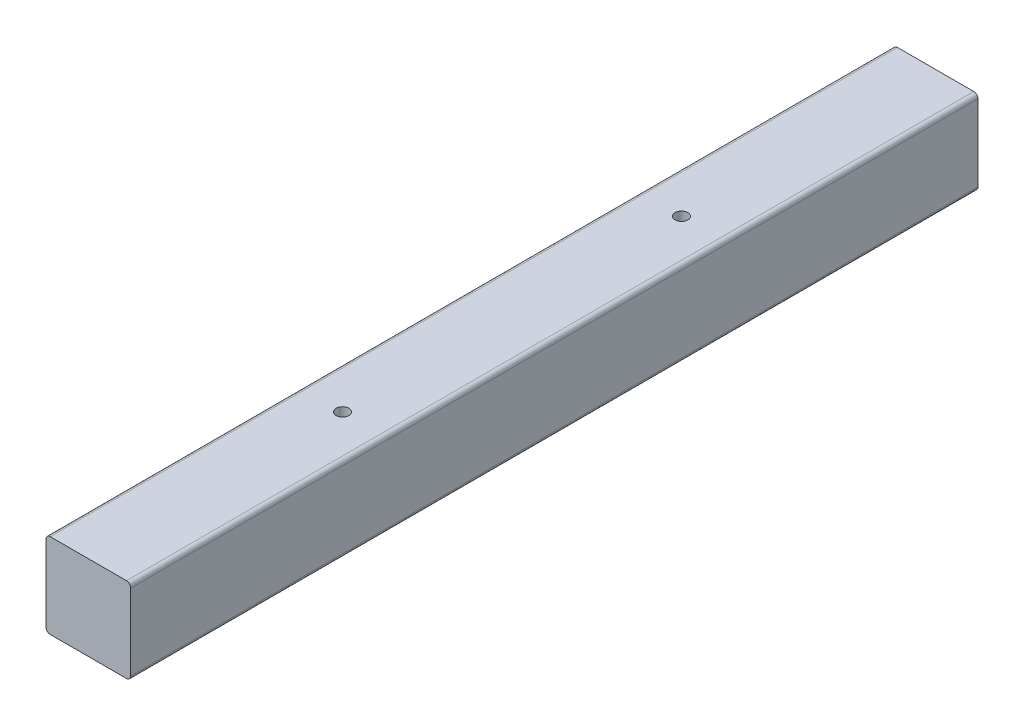
ISO-10303-21;
HEADER;
FILE_DESCRIPTION(('STEP AP214'),'2;1');
FILE_NAME('part.step','',(''),(''),'','','');
FILE_SCHEMA(('AUTOMOTIVE_DESIGN { 1 0 10303 214 1 1 1 1 }'));
ENDSEC;
DATA;
#1=APPLICATION_CONTEXT('core data for automotive mechanical design processes');
#2=APPLICATION_PROTOCOL_DEFINITION('international standard','automotive_design',2000,#1);
#3=PRODUCT_CONTEXT('',#1,'mechanical');
#4=PRODUCT('Part','Part','',(#3));
#5=PRODUCT_RELATED_PRODUCT_CATEGORY('part','',(#4));
#6=PRODUCT_DEFINITION_FORMATION('','',#4);
#7=PRODUCT_DEFINITION_CONTEXT('part definition',#1,'design');
#8=PRODUCT_DEFINITION('design','',#6,#7);
#9=PRODUCT_DEFINITION_SHAPE('','',#8);
#10=(LENGTH_UNIT() NAMED_UNIT(*) SI_UNIT(.MILLI.,.METRE.));
#11=(NAMED_UNIT(*) PLANE_ANGLE_UNIT() SI_UNIT($,.RADIAN.));
#12=(NAMED_UNIT(*) SI_UNIT($,.STERADIAN.) SOLID_ANGLE_UNIT());
#13=UNCERTAINTY_MEASURE_WITH_UNIT(LENGTH_MEASURE(1.E-05),#10,'distance_accuracy_value','');
#14=(GEOMETRIC_REPRESENTATION_CONTEXT(3) GLOBAL_UNCERTAINTY_ASSIGNED_CONTEXT((#13)) GLOBAL_UNIT_ASSIGNED_CONTEXT((#10,
#11,#12)) REPRESENTATION_CONTEXT('',''));
#15=CARTESIAN_POINT('',(0.,0.,0.));
#16=DIRECTION('',(0.,0.,1.));
#17=DIRECTION('',(1.,0.,0.));
#18=AXIS2_PLACEMENT_3D('',#15,#16,#17);
#19=CARTESIAN_POINT('',(-10.,10.,100.));
#20=DIRECTION('',(1.,0.,0.));
#21=DIRECTION('',(0.,1.,0.));
#22=AXIS2_PLACEMENT_3D('',#19,#20,#21);
#23=PLANE('',#22);
#24=DIRECTION('',(0.,-1.,0.));
#25=VECTOR('',#24,1.);
#26=CARTESIAN_POINT('',(-10.,10.,-100.));
#27=LINE('',#26,#25);
#28=CARTESIAN_POINT('',(-10.,9.,-100.));
#29=VERTEX_POINT('',#28);
#30=CARTESIAN_POINT('',(-10.,-9.,-100.));
#31=VERTEX_POINT('',#30);
#32=EDGE_CURVE('E124',#29,#31,#27,.T.);
#33=ORIENTED_EDGE('',*,*,#32,.T.);
#34=DIRECTION('',(0.,0.,-1.));
#35=VECTOR('',#34,1.);
#36=CARTESIAN_POINT('',(-10.,-9.,100.));
#37=LINE('',#36,#35);
#38=CARTESIAN_POINT('',(-10.,-9.,100.));
#39=VERTEX_POINT('',#38);
#40=EDGE_CURVE('E102',#31,#39,#37,.F.);
#41=ORIENTED_EDGE('',*,*,#40,.T.);
#42=DIRECTION('',(0.,-1.,0.));
#43=VECTOR('',#42,1.);
#44=CARTESIAN_POINT('',(-10.,10.,100.));
#45=LINE('',#44,#43);
#46=CARTESIAN_POINT('',(-10.,9.,100.));
#47=VERTEX_POINT('',#46);
#48=EDGE_CURVE('E134',#47,#39,#45,.T.);
#49=ORIENTED_EDGE('',*,*,#48,.F.);
#50=DIRECTION('',(0.,0.,-1.));
#51=VECTOR('',#50,1.);
#52=CARTESIAN_POINT('',(-10.,9.,100.));
#53=LINE('',#52,#51);
#54=EDGE_CURVE('E107',#47,#29,#53,.T.);
#55=ORIENTED_EDGE('',*,*,#54,.T.);
#56=EDGE_LOOP('',(#33,#41,#49,#55));
#57=FACE_BOUND('',#56,.T.);
#58=ADVANCED_FACE('F31',(#57),#23,.F.);
#59=CARTESIAN_POINT('',(-10.,-10.,100.));
#60=DIRECTION('',(0.,1.,0.));
#61=DIRECTION('',(0.,0.,1.));
#62=AXIS2_PLACEMENT_3D('',#59,#60,#61);
#63=PLANE('',#62);
#64=CARTESIAN_POINT('',(0.,-10.,40.));
#65=DIRECTION('',(0.,1.,0.));
#66=DIRECTION('',(0.,0.,1.));
#67=AXIS2_PLACEMENT_3D('',#64,#65,#66);
#68=CIRCLE('',#67,1.5);
#69=CARTESIAN_POINT('',(-1.5,-10.,40.));
#70=VERTEX_POINT('',#69);
#71=EDGE_CURVE('E179',#70,#70,#68,.F.);
#72=ORIENTED_EDGE('',*,*,#71,.F.);
#73=EDGE_LOOP('',(#72));
#74=FACE_BOUND('',#73,.T.);
#75=CARTESIAN_POINT('',(0.,-10.,-40.));
#76=DIRECTION('',(0.,1.,0.));
#77=DIRECTION('',(0.,0.,1.));
#78=AXIS2_PLACEMENT_3D('',#75,#76,#77);
#79=CIRCLE('',#78,1.5);
#80=CARTESIAN_POINT('',(-1.5,-10.,-40.));
#81=VERTEX_POINT('',#80);
#82=EDGE_CURVE('E129',#81,#81,#79,.F.);
#83=ORIENTED_EDGE('',*,*,#82,.F.);
#84=EDGE_LOOP('',(#83));
#85=FACE_BOUND('',#84,.T.);
#86=DIRECTION('',(1.,0.,0.));
#87=VECTOR('',#86,1.);
#88=CARTESIAN_POINT('',(-10.,-10.,100.));
#89=LINE('',#88,#87);
#90=CARTESIAN_POINT('',(-9.,-10.,100.));
#91=VERTEX_POINT('',#90);
#92=CARTESIAN_POINT('',(9.,-10.,100.));
#93=VERTEX_POINT('',#92);
#94=EDGE_CURVE('E117',#91,#93,#89,.T.);
#95=ORIENTED_EDGE('',*,*,#94,.F.);
#96=DIRECTION('',(0.,0.,-1.));
#97=VECTOR('',#96,1.);
#98=CARTESIAN_POINT('',(-9.,-10.,100.));
#99=LINE('',#98,#97);
#100=CARTESIAN_POINT('',(-9.,-10.,-100.));
#101=VERTEX_POINT('',#100);
#102=EDGE_CURVE('E101',#91,#101,#99,.T.);
#103=ORIENTED_EDGE('',*,*,#102,.T.);
#104=DIRECTION('',(1.,0.,0.));
#105=VECTOR('',#104,1.);
#106=CARTESIAN_POINT('',(-10.,-10.,-100.));
#107=LINE('',#106,#105);
#108=CARTESIAN_POINT('',(9.,-10.,-100.));
#109=VERTEX_POINT('',#108);
#110=EDGE_CURVE('E114',#101,#109,#107,.T.);
#111=ORIENTED_EDGE('',*,*,#110,.T.);
#112=DIRECTION('',(0.,0.,-1.));
#113=VECTOR('',#112,1.);
#114=CARTESIAN_POINT('',(9.,-10.,100.));
#115=LINE('',#114,#113);
#116=EDGE_CURVE('E119',#109,#93,#115,.F.);
#117=ORIENTED_EDGE('',*,*,#116,.T.);
#118=EDGE_LOOP('',(#95,#103,#111,#117));
#119=FACE_BOUND('',#118,.T.);
#120=ADVANCED_FACE('F113',(#74,#85,#119),#63,.F.);
#121=CARTESIAN_POINT('',(10.,10.,100.));
#122=DIRECTION('',(-1.,0.,0.));
#123=DIRECTION('',(0.,-1.,0.));
#124=AXIS2_PLACEMENT_3D('',#121,#122,#123);
#125=PLANE('',#124);
#126=DIRECTION('',(0.,1.,0.));
#127=VECTOR('',#126,1.);
#128=CARTESIAN_POINT('',(10.,10.,100.));
#129=LINE('',#128,#127);
#130=CARTESIAN_POINT('',(10.,-9.,100.));
#131=VERTEX_POINT('',#130);
#132=CARTESIAN_POINT('',(10.,9.,100.));
#133=VERTEX_POINT('',#132);
#134=EDGE_CURVE('E160',#131,#133,#129,.T.);
#135=ORIENTED_EDGE('',*,*,#134,.F.);
#136=DIRECTION('',(0.,0.,-1.));
#137=VECTOR('',#136,1.);
#138=CARTESIAN_POINT('',(10.,-9.,100.));
#139=LINE('',#138,#137);
#140=CARTESIAN_POINT('',(10.,-9.,-100.));
#141=VERTEX_POINT('',#140);
#142=EDGE_CURVE('E153',#131,#141,#139,.T.);
#143=ORIENTED_EDGE('',*,*,#142,.T.);
#144=DIRECTION('',(0.,1.,0.));
#145=VECTOR('',#144,1.);
#146=CARTESIAN_POINT('',(10.,10.,-100.));
#147=LINE('',#146,#145);
#148=CARTESIAN_POINT('',(10.,9.,-100.));
#149=VERTEX_POINT('',#148);
#150=EDGE_CURVE('E123',#141,#149,#147,.T.);
#151=ORIENTED_EDGE('',*,*,#150,.T.);
#152=DIRECTION('',(0.,0.,-1.));
#153=VECTOR('',#152,1.);
#154=CARTESIAN_POINT('',(10.,9.,100.));
#155=LINE('',#154,#153);
#156=EDGE_CURVE('E151',#149,#133,#155,.F.);
#157=ORIENTED_EDGE('',*,*,#156,.T.);
#158=EDGE_LOOP('',(#135,#143,#151,#157));
#159=FACE_BOUND('',#158,.T.);
#160=ADVANCED_FACE('F158',(#159),#125,.F.);
#161=CARTESIAN_POINT('',(-10.,10.,100.));
#162=DIRECTION('',(0.,-1.,0.));
#163=DIRECTION('',(1.,0.,0.));
#164=AXIS2_PLACEMENT_3D('',#161,#162,#163);
#165=PLANE('',#164);
#166=CARTESIAN_POINT('',(0.,10.,40.));
#167=DIRECTION('',(0.,1.,0.));
#168=DIRECTION('',(-1.,0.,0.));
#169=AXIS2_PLACEMENT_3D('',#166,#167,#168);
#170=CIRCLE('',#169,1.5);
#171=CARTESIAN_POINT('',(-1.5,10.,40.));
#172=VERTEX_POINT('',#171);
#173=EDGE_CURVE('E182',#172,#172,#170,.T.);
#174=ORIENTED_EDGE('',*,*,#173,.F.);
#175=EDGE_LOOP('',(#174));
#176=FACE_BOUND('',#175,.T.);
#177=CARTESIAN_POINT('',(0.,10.,-40.));
#178=DIRECTION('',(0.,1.,0.));
#179=DIRECTION('',(-1.,0.,0.));
#180=AXIS2_PLACEMENT_3D('',#177,#178,#179);
#181=CIRCLE('',#180,1.5);
#182=CARTESIAN_POINT('',(-1.5,10.,-40.));
#183=VERTEX_POINT('',#182);
#184=EDGE_CURVE('E176',#183,#183,#181,.T.);
#185=ORIENTED_EDGE('',*,*,#184,.F.);
#186=EDGE_LOOP('',(#185));
#187=FACE_BOUND('',#186,.T.);
#188=DIRECTION('',(-1.,0.,0.));
#189=VECTOR('',#188,1.);
#190=CARTESIAN_POINT('',(-10.,10.,100.));
#191=LINE('',#190,#189);
#192=CARTESIAN_POINT('',(9.,10.,100.));
#193=VERTEX_POINT('',#192);
#194=CARTESIAN_POINT('',(-9.,10.,100.));
#195=VERTEX_POINT('',#194);
#196=EDGE_CURVE('E135',#193,#195,#191,.T.);
#197=ORIENTED_EDGE('',*,*,#196,.F.);
#198=DIRECTION('',(0.,0.,-1.));
#199=VECTOR('',#198,1.);
#200=CARTESIAN_POINT('',(9.,10.,100.));
#201=LINE('',#200,#199);
#202=CARTESIAN_POINT('',(9.,10.,-100.));
#203=VERTEX_POINT('',#202);
#204=EDGE_CURVE('E11',#193,#203,#201,.T.);
#205=ORIENTED_EDGE('',*,*,#204,.T.);
#206=DIRECTION('',(-1.,0.,0.));
#207=VECTOR('',#206,1.);
#208=CARTESIAN_POINT('',(-10.,10.,-100.));
#209=LINE('',#208,#207);
#210=CARTESIAN_POINT('',(-9.,10.,-100.));
#211=VERTEX_POINT('',#210);
#212=EDGE_CURVE('E127',#203,#211,#209,.T.);
#213=ORIENTED_EDGE('',*,*,#212,.T.);
#214=DIRECTION('',(0.,0.,-1.));
#215=VECTOR('',#214,1.);
#216=CARTESIAN_POINT('',(-9.,10.,100.));
#217=LINE('',#216,#215);
#218=EDGE_CURVE('E39',#211,#195,#217,.F.);
#219=ORIENTED_EDGE('',*,*,#218,.T.);
#220=EDGE_LOOP('',(#197,#205,#213,#219));
#221=FACE_BOUND('',#220,.T.);
#222=ADVANCED_FACE('F167',(#176,#187,#221),#165,.F.);
#223=CARTESIAN_POINT('',(-10.,-10.,100.));
#224=DIRECTION('',(0.,0.,1.));
#225=DIRECTION('',(1.,0.,0.));
#226=AXIS2_PLACEMENT_3D('',#223,#224,#225);
#227=PLANE('',#226);
#228=ORIENTED_EDGE('',*,*,#48,.T.);
#229=CARTESIAN_POINT('',(-9.,-9.,100.));
#230=DIRECTION('',(0.,0.,1.));
#231=DIRECTION('',(1.,0.,0.));
#232=AXIS2_PLACEMENT_3D('',#229,#230,#231);
#233=CIRCLE('',#232,1.);
#234=EDGE_CURVE('E149',#39,#91,#233,.T.);
#235=ORIENTED_EDGE('',*,*,#234,.T.);
#236=ORIENTED_EDGE('',*,*,#94,.T.);
#237=CARTESIAN_POINT('',(9.,-9.,100.));
#238=DIRECTION('',(0.,0.,1.));
#239=DIRECTION('',(1.,0.,0.));
#240=AXIS2_PLACEMENT_3D('',#237,#238,#239);
#241=CIRCLE('',#240,1.);
#242=EDGE_CURVE('E147',#93,#131,#241,.T.);
#243=ORIENTED_EDGE('',*,*,#242,.T.);
#244=ORIENTED_EDGE('',*,*,#134,.T.);
#245=CARTESIAN_POINT('',(9.,9.,100.));
#246=DIRECTION('',(0.,0.,1.));
#247=DIRECTION('',(1.,0.,0.));
#248=AXIS2_PLACEMENT_3D('',#245,#246,#247);
#249=CIRCLE('',#248,1.);
#250=EDGE_CURVE('E52',#133,#193,#249,.T.);
#251=ORIENTED_EDGE('',*,*,#250,.T.);
#252=ORIENTED_EDGE('',*,*,#196,.T.);
#253=CARTESIAN_POINT('',(-9.,9.,100.));
#254=DIRECTION('',(0.,0.,1.));
#255=DIRECTION('',(1.,0.,0.));
#256=AXIS2_PLACEMENT_3D('',#253,#254,#255);
#257=CIRCLE('',#256,1.);
#258=EDGE_CURVE('E144',#195,#47,#257,.T.);
#259=ORIENTED_EDGE('',*,*,#258,.T.);
#260=EDGE_LOOP('',(#228,#235,#236,#243,#244,#251,#252,#259));
#261=FACE_BOUND('',#260,.T.);
#262=ADVANCED_FACE('F191',(#261),#227,.T.);
#263=CARTESIAN_POINT('',(-10.,-10.,-100.));
#264=DIRECTION('',(0.,0.,1.));
#265=DIRECTION('',(1.,0.,0.));
#266=AXIS2_PLACEMENT_3D('',#263,#264,#265);
#267=PLANE('',#266);
#268=ORIENTED_EDGE('',*,*,#110,.F.);
#269=CARTESIAN_POINT('',(-9.,-9.,-100.));
#270=DIRECTION('',(0.,0.,1.));
#271=DIRECTION('',(1.,0.,0.));
#272=AXIS2_PLACEMENT_3D('',#269,#270,#271);
#273=CIRCLE('',#272,1.);
#274=EDGE_CURVE('E97',#101,#31,#273,.F.);
#275=ORIENTED_EDGE('',*,*,#274,.T.);
#276=ORIENTED_EDGE('',*,*,#32,.F.);
#277=CARTESIAN_POINT('',(-9.,9.,-100.));
#278=DIRECTION('',(0.,0.,1.));
#279=DIRECTION('',(1.,0.,0.));
#280=AXIS2_PLACEMENT_3D('',#277,#278,#279);
#281=CIRCLE('',#280,1.);
#282=EDGE_CURVE('E118',#29,#211,#281,.F.);
#283=ORIENTED_EDGE('',*,*,#282,.T.);
#284=ORIENTED_EDGE('',*,*,#212,.F.);
#285=CARTESIAN_POINT('',(9.,9.,-100.));
#286=DIRECTION('',(0.,0.,1.));
#287=DIRECTION('',(1.,0.,0.));
#288=AXIS2_PLACEMENT_3D('',#285,#286,#287);
#289=CIRCLE('',#288,1.);
#290=EDGE_CURVE('E138',#203,#149,#289,.F.);
#291=ORIENTED_EDGE('',*,*,#290,.T.);
#292=ORIENTED_EDGE('',*,*,#150,.F.);
#293=CARTESIAN_POINT('',(9.,-9.,-100.));
#294=DIRECTION('',(0.,0.,1.));
#295=DIRECTION('',(1.,0.,0.));
#296=AXIS2_PLACEMENT_3D('',#293,#294,#295);
#297=CIRCLE('',#296,1.);
#298=EDGE_CURVE('E108',#141,#109,#297,.F.);
#299=ORIENTED_EDGE('',*,*,#298,.T.);
#300=EDGE_LOOP('',(#268,#275,#276,#283,#284,#291,#292,#299));
#301=FACE_BOUND('',#300,.T.);
#302=ADVANCED_FACE('F121',(#301),#267,.F.);
#303=CARTESIAN_POINT('',(-9.,-9.,100.));
#304=DIRECTION('',(0.,0.,-1.));
#305=DIRECTION('',(-1.,0.,0.));
#306=AXIS2_PLACEMENT_3D('',#303,#304,#305);
#307=CYLINDRICAL_SURFACE('',#306,1.);
#308=ORIENTED_EDGE('',*,*,#234,.F.);
#309=ORIENTED_EDGE('',*,*,#40,.F.);
#310=ORIENTED_EDGE('',*,*,#274,.F.);
#311=ORIENTED_EDGE('',*,*,#102,.F.);
#312=EDGE_LOOP('',(#308,#309,#310,#311));
#313=FACE_BOUND('',#312,.T.);
#314=ADVANCED_FACE('F100',(#313),#307,.T.);
#315=CARTESIAN_POINT('',(9.,-9.,100.));
#316=DIRECTION('',(0.,0.,-1.));
#317=DIRECTION('',(-1.,0.,0.));
#318=AXIS2_PLACEMENT_3D('',#315,#316,#317);
#319=CYLINDRICAL_SURFACE('',#318,1.);
#320=ORIENTED_EDGE('',*,*,#242,.F.);
#321=ORIENTED_EDGE('',*,*,#116,.F.);
#322=ORIENTED_EDGE('',*,*,#298,.F.);
#323=ORIENTED_EDGE('',*,*,#142,.F.);
#324=EDGE_LOOP('',(#320,#321,#322,#323));
#325=FACE_BOUND('',#324,.T.);
#326=ADVANCED_FACE('F216',(#325),#319,.T.);
#327=CARTESIAN_POINT('',(9.,9.,100.));
#328=DIRECTION('',(0.,0.,-1.));
#329=DIRECTION('',(-1.,0.,0.));
#330=AXIS2_PLACEMENT_3D('',#327,#328,#329);
#331=CYLINDRICAL_SURFACE('',#330,1.);
#332=ORIENTED_EDGE('',*,*,#250,.F.);
#333=ORIENTED_EDGE('',*,*,#156,.F.);
#334=ORIENTED_EDGE('',*,*,#290,.F.);
#335=ORIENTED_EDGE('',*,*,#204,.F.);
#336=EDGE_LOOP('',(#332,#333,#334,#335));
#337=FACE_BOUND('',#336,.T.);
#338=ADVANCED_FACE('F166',(#337),#331,.T.);
#339=CARTESIAN_POINT('',(-9.,9.,100.));
#340=DIRECTION('',(0.,0.,-1.));
#341=DIRECTION('',(-1.,0.,0.));
#342=AXIS2_PLACEMENT_3D('',#339,#340,#341);
#343=CYLINDRICAL_SURFACE('',#342,1.);
#344=ORIENTED_EDGE('',*,*,#258,.F.);
#345=ORIENTED_EDGE('',*,*,#218,.F.);
#346=ORIENTED_EDGE('',*,*,#282,.F.);
#347=ORIENTED_EDGE('',*,*,#54,.F.);
#348=EDGE_LOOP('',(#344,#345,#346,#347));
#349=FACE_BOUND('',#348,.T.);
#350=ADVANCED_FACE('F33',(#349),#343,.T.);
#351=CARTESIAN_POINT('',(0.,-10.001,-40.));
#352=DIRECTION('',(0.,1.,0.));
#353=DIRECTION('',(-1.,0.,0.));
#354=AXIS2_PLACEMENT_3D('',#351,#352,#353);
#355=CYLINDRICAL_SURFACE('',#354,1.5);
#356=CARTESIAN_POINT('',(-1.5,10.,-40.));
#357=CARTESIAN_POINT('',(-1.5,9.79166666666667,-40.));
#358=CARTESIAN_POINT('',(-1.5,9.58333333333333,-40.));
#359=CARTESIAN_POINT('',(-1.5,9.16666666666666,-40.));
#360=CARTESIAN_POINT('',(-1.5,8.95833333333333,-40.));
#361=CARTESIAN_POINT('',(-1.5,8.54166666666666,-40.));
#362=CARTESIAN_POINT('',(-1.5,8.33333333333333,-40.));
#363=CARTESIAN_POINT('',(-1.5,7.91666666666666,-40.));
#364=CARTESIAN_POINT('',(-1.5,7.70833333333333,-40.));
#365=CARTESIAN_POINT('',(-1.5,7.29166666666666,-40.));
#366=CARTESIAN_POINT('',(-1.5,7.08333333333333,-40.));
#367=CARTESIAN_POINT('',(-1.5,6.66666666666667,-40.));
#368=CARTESIAN_POINT('',(-1.5,6.45833333333333,-40.));
#369=CARTESIAN_POINT('',(-1.5,6.04166666666667,-40.));
#370=CARTESIAN_POINT('',(-1.5,5.83333333333333,-40.));
#371=CARTESIAN_POINT('',(-1.5,5.41666666666667,-40.));
#372=CARTESIAN_POINT('',(-1.5,5.20833333333333,-40.));
#373=CARTESIAN_POINT('',(-1.5,4.79166666666667,-40.));
#374=CARTESIAN_POINT('',(-1.5,4.58333333333333,-40.));
#375=CARTESIAN_POINT('',(-1.5,4.16666666666667,-40.));
#376=CARTESIAN_POINT('',(-1.5,3.95833333333333,-40.));
#377=CARTESIAN_POINT('',(-1.5,3.54166666666667,-40.));
#378=CARTESIAN_POINT('',(-1.5,3.33333333333333,-40.));
#379=CARTESIAN_POINT('',(-1.5,2.91666666666667,-40.));
#380=CARTESIAN_POINT('',(-1.5,2.70833333333333,-40.));
#381=CARTESIAN_POINT('',(-1.5,2.29166666666667,-40.));
#382=CARTESIAN_POINT('',(-1.5,2.08333333333333,-40.));
#383=CARTESIAN_POINT('',(-1.5,1.66666666666667,-40.));
#384=CARTESIAN_POINT('',(-1.5,1.45833333333333,-40.));
#385=CARTESIAN_POINT('',(-1.5,1.04166666666667,-40.));
#386=CARTESIAN_POINT('',(-1.5,0.833333333333332,-40.));
#387=CARTESIAN_POINT('',(-1.5,0.416666666666665,-40.));
#388=CARTESIAN_POINT('',(-1.5,0.208333333333332,-40.));
#389=CARTESIAN_POINT('',(-1.5,-0.208333333333335,-40.));
#390=CARTESIAN_POINT('',(-1.5,-0.416666666666669,-40.));
#391=CARTESIAN_POINT('',(-1.5,-0.833333333333336,-40.));
#392=CARTESIAN_POINT('',(-1.5,-1.04166666666667,-40.));
#393=CARTESIAN_POINT('',(-1.5,-1.45833333333334,-40.));
#394=CARTESIAN_POINT('',(-1.5,-1.66666666666667,-40.));
#395=CARTESIAN_POINT('',(-1.5,-2.08333333333334,-40.));
#396=CARTESIAN_POINT('',(-1.5,-2.29166666666667,-40.));
#397=CARTESIAN_POINT('',(-1.5,-2.70833333333333,-40.));
#398=CARTESIAN_POINT('',(-1.5,-2.91666666666667,-40.));
#399=CARTESIAN_POINT('',(-1.5,-3.33333333333333,-40.));
#400=CARTESIAN_POINT('',(-1.5,-3.54166666666667,-40.));
#401=CARTESIAN_POINT('',(-1.5,-3.95833333333333,-40.));
#402=CARTESIAN_POINT('',(-1.5,-4.16666666666667,-40.));
#403=CARTESIAN_POINT('',(-1.5,-4.58333333333333,-40.));
#404=CARTESIAN_POINT('',(-1.5,-4.79166666666667,-40.));
#405=CARTESIAN_POINT('',(-1.5,-5.20833333333334,-40.));
#406=CARTESIAN_POINT('',(-1.5,-5.41666666666667,-40.));
#407=CARTESIAN_POINT('',(-1.5,-5.83333333333334,-40.));
#408=CARTESIAN_POINT('',(-1.5,-6.04166666666667,-40.));
#409=CARTESIAN_POINT('',(-1.5,-6.45833333333334,-40.));
#410=CARTESIAN_POINT('',(-1.5,-6.66666666666667,-40.));
#411=CARTESIAN_POINT('',(-1.5,-7.08333333333333,-40.));
#412=CARTESIAN_POINT('',(-1.5,-7.29166666666667,-40.));
#413=CARTESIAN_POINT('',(-1.5,-7.70833333333333,-40.));
#414=CARTESIAN_POINT('',(-1.5,-7.91666666666667,-40.));
#415=CARTESIAN_POINT('',(-1.5,-8.33333333333333,-40.));
#416=CARTESIAN_POINT('',(-1.5,-8.54166666666667,-40.));
#417=CARTESIAN_POINT('',(-1.5,-8.95833333333333,-40.));
#418=CARTESIAN_POINT('',(-1.5,-9.16666666666667,-40.));
#419=CARTESIAN_POINT('',(-1.5,-9.58333333333333,-40.));
#420=CARTESIAN_POINT('',(-1.5,-9.79166666666667,-40.));
#421=CARTESIAN_POINT('',(-1.5,-10.,-40.));
#422=B_SPLINE_CURVE_WITH_KNOTS('',3,(#356,#357,#358,#359,#360,#361,#362,#363,#364,#365,#366,
#367,#368,#369,#370,#371,#372,#373,#374,#375,#376,#377,#378,#379,#380,#381,#382,#383,#384,#385,
#386,#387,#388,#389,#390,#391,#392,#393,#394,#395,#396,#397,#398,#399,#400,#401,#402,#403,#404,
#405,#406,#407,#408,#409,#410,#411,#412,#413,#414,#415,#416,#417,#418,#419,#420,#421),
.UNSPECIFIED.,.F.,.F.,(4,2,2,2,2,2,2,2,2,2,2,2,2,2,2,2,2,2,2,2,2,2,2,2,2,2,2,2,2,2,2,2,4),(0.,
0.625000000000001,1.25,1.875,2.5,3.125,3.75,4.375,5.,5.625,6.25,6.875,7.5,8.125,8.75,9.375,10.,
10.625,11.25,11.875,12.5,13.125,13.75,14.375,15.,15.625,16.25,16.875,17.5,18.125,18.75,19.375,
20.),.UNSPECIFIED.);
#423=EDGE_CURVE('BSEAM195',#183,#81,#422,.T.);
#424=ORIENTED_EDGE('',*,*,#184,.T.);
#425=ORIENTED_EDGE('',*,*,#82,.T.);
#426=ORIENTED_EDGE('',*,*,#423,.T.);
#427=ORIENTED_EDGE('',*,*,#423,.F.);
#428=EDGE_LOOP('',(#424,#426,#425,#427));
#429=FACE_BOUND('',#428,.T.);
#430=ADVANCED_FACE('F195',(#429),#355,.F.);
#431=CARTESIAN_POINT('',(0.,-10.001,40.));
#432=DIRECTION('',(0.,1.,0.));
#433=DIRECTION('',(-1.,0.,0.));
#434=AXIS2_PLACEMENT_3D('',#431,#432,#433);
#435=CYLINDRICAL_SURFACE('',#434,1.5);
#436=CARTESIAN_POINT('',(-1.5,10.,40.));
#437=CARTESIAN_POINT('',(-1.5,9.79166666666667,40.));
#438=CARTESIAN_POINT('',(-1.5,9.58333333333333,40.));
#439=CARTESIAN_POINT('',(-1.5,9.16666666666666,40.));
#440=CARTESIAN_POINT('',(-1.5,8.95833333333333,40.));
#441=CARTESIAN_POINT('',(-1.5,8.54166666666666,40.));
#442=CARTESIAN_POINT('',(-1.5,8.33333333333333,40.));
#443=CARTESIAN_POINT('',(-1.5,7.91666666666666,40.));
#444=CARTESIAN_POINT('',(-1.5,7.70833333333333,40.));
#445=CARTESIAN_POINT('',(-1.5,7.29166666666666,40.));
#446=CARTESIAN_POINT('',(-1.5,7.08333333333333,40.));
#447=CARTESIAN_POINT('',(-1.5,6.66666666666667,40.));
#448=CARTESIAN_POINT('',(-1.5,6.45833333333333,40.));
#449=CARTESIAN_POINT('',(-1.5,6.04166666666667,40.));
#450=CARTESIAN_POINT('',(-1.5,5.83333333333333,40.));
#451=CARTESIAN_POINT('',(-1.5,5.41666666666667,40.));
#452=CARTESIAN_POINT('',(-1.5,5.20833333333333,40.));
#453=CARTESIAN_POINT('',(-1.5,4.79166666666667,40.));
#454=CARTESIAN_POINT('',(-1.5,4.58333333333333,40.));
#455=CARTESIAN_POINT('',(-1.5,4.16666666666667,40.));
#456=CARTESIAN_POINT('',(-1.5,3.95833333333333,40.));
#457=CARTESIAN_POINT('',(-1.5,3.54166666666667,40.));
#458=CARTESIAN_POINT('',(-1.5,3.33333333333333,40.));
#459=CARTESIAN_POINT('',(-1.5,2.91666666666667,40.));
#460=CARTESIAN_POINT('',(-1.5,2.70833333333333,40.));
#461=CARTESIAN_POINT('',(-1.5,2.29166666666667,40.));
#462=CARTESIAN_POINT('',(-1.5,2.08333333333333,40.));
#463=CARTESIAN_POINT('',(-1.5,1.66666666666667,40.));
#464=CARTESIAN_POINT('',(-1.5,1.45833333333333,40.));
#465=CARTESIAN_POINT('',(-1.5,1.04166666666667,40.));
#466=CARTESIAN_POINT('',(-1.5,0.833333333333332,40.));
#467=CARTESIAN_POINT('',(-1.5,0.416666666666665,40.));
#468=CARTESIAN_POINT('',(-1.5,0.208333333333332,40.));
#469=CARTESIAN_POINT('',(-1.5,-0.208333333333335,40.));
#470=CARTESIAN_POINT('',(-1.5,-0.416666666666669,40.));
#471=CARTESIAN_POINT('',(-1.5,-0.833333333333336,40.));
#472=CARTESIAN_POINT('',(-1.5,-1.04166666666667,40.));
#473=CARTESIAN_POINT('',(-1.5,-1.45833333333334,40.));
#474=CARTESIAN_POINT('',(-1.5,-1.66666666666667,40.));
#475=CARTESIAN_POINT('',(-1.5,-2.08333333333334,40.));
#476=CARTESIAN_POINT('',(-1.5,-2.29166666666667,40.));
#477=CARTESIAN_POINT('',(-1.5,-2.70833333333333,40.));
#478=CARTESIAN_POINT('',(-1.5,-2.91666666666667,40.));
#479=CARTESIAN_POINT('',(-1.5,-3.33333333333333,40.));
#480=CARTESIAN_POINT('',(-1.5,-3.54166666666667,40.));
#481=CARTESIAN_POINT('',(-1.5,-3.95833333333333,40.));
#482=CARTESIAN_POINT('',(-1.5,-4.16666666666667,40.));
#483=CARTESIAN_POINT('',(-1.5,-4.58333333333333,40.));
#484=CARTESIAN_POINT('',(-1.5,-4.79166666666667,40.));
#485=CARTESIAN_POINT('',(-1.5,-5.20833333333334,40.));
#486=CARTESIAN_POINT('',(-1.5,-5.41666666666667,40.));
#487=CARTESIAN_POINT('',(-1.5,-5.83333333333334,40.));
#488=CARTESIAN_POINT('',(-1.5,-6.04166666666667,40.));
#489=CARTESIAN_POINT('',(-1.5,-6.45833333333334,40.));
#490=CARTESIAN_POINT('',(-1.5,-6.66666666666667,40.));
#491=CARTESIAN_POINT('',(-1.5,-7.08333333333333,40.));
#492=CARTESIAN_POINT('',(-1.5,-7.29166666666667,40.));
#493=CARTESIAN_POINT('',(-1.5,-7.70833333333333,40.));
#494=CARTESIAN_POINT('',(-1.5,-7.91666666666667,40.));
#495=CARTESIAN_POINT('',(-1.5,-8.33333333333333,40.));
#496=CARTESIAN_POINT('',(-1.5,-8.54166666666667,40.));
#497=CARTESIAN_POINT('',(-1.5,-8.95833333333333,40.));
#498=CARTESIAN_POINT('',(-1.5,-9.16666666666667,40.));
#499=CARTESIAN_POINT('',(-1.5,-9.58333333333333,40.));
#500=CARTESIAN_POINT('',(-1.5,-9.79166666666667,40.));
#501=CARTESIAN_POINT('',(-1.5,-10.,40.));
#502=B_SPLINE_CURVE_WITH_KNOTS('',3,(#436,#437,#438,#439,#440,#441,#442,#443,#444,#445,#446,
#447,#448,#449,#450,#451,#452,#453,#454,#455,#456,#457,#458,#459,#460,#461,#462,#463,#464,#465,
#466,#467,#468,#469,#470,#471,#472,#473,#474,#475,#476,#477,#478,#479,#480,#481,#482,#483,#484,
#485,#486,#487,#488,#489,#490,#491,#492,#493,#494,#495,#496,#497,#498,#499,#500,#501),
.UNSPECIFIED.,.F.,.F.,(4,2,2,2,2,2,2,2,2,2,2,2,2,2,2,2,2,2,2,2,2,2,2,2,2,2,2,2,2,2,2,2,4),(0.,
0.625000000000001,1.25,1.875,2.5,3.125,3.75,4.375,5.,5.625,6.25,6.875,7.5,8.125,8.75,9.375,10.,
10.625,11.25,11.875,12.5,13.125,13.75,14.375,15.,15.625,16.25,16.875,17.5,18.125,18.75,19.375,
20.),.UNSPECIFIED.);
#503=EDGE_CURVE('BSEAM186',#172,#70,#502,.T.);
#504=ORIENTED_EDGE('',*,*,#173,.T.);
#505=ORIENTED_EDGE('',*,*,#71,.T.);
#506=ORIENTED_EDGE('',*,*,#503,.T.);
#507=ORIENTED_EDGE('',*,*,#503,.F.);
#508=EDGE_LOOP('',(#504,#506,#505,#507));
#509=FACE_BOUND('',#508,.T.);
#510=ADVANCED_FACE('F186',(#509),#435,.F.);
#511=CLOSED_SHELL('',(#58,#120,#160,#222,#262,#302,#314,#326,#338,#350,#430,#510));
#512=MANIFOLD_SOLID_BREP('B2',#511);
#513=ADVANCED_BREP_SHAPE_REPRESENTATION('',(#18,#512),#14);
#514=SHAPE_DEFINITION_REPRESENTATION(#9,#513);
ENDSEC;
END-ISO-10303-21;
